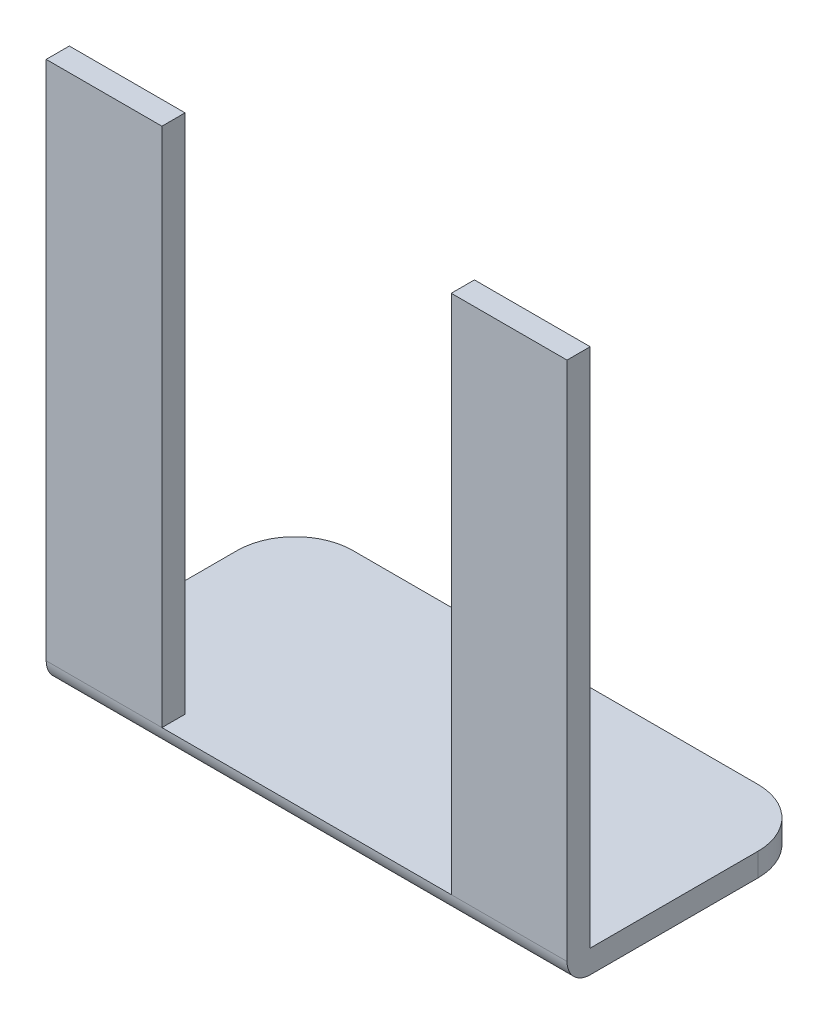
ISO-10303-21;
HEADER;
FILE_DESCRIPTION(('STEP AP214'),'2;1');
FILE_NAME('part.step','',(''),(''),'','','');
FILE_SCHEMA(('AUTOMOTIVE_DESIGN { 1 0 10303 214 1 1 1 1 }'));
ENDSEC;
DATA;
#1=APPLICATION_CONTEXT('core data for automotive mechanical design processes');
#2=APPLICATION_PROTOCOL_DEFINITION('international standard','automotive_design',2000,#1);
#3=PRODUCT_CONTEXT('',#1,'mechanical');
#4=PRODUCT('Part','Part','',(#3));
#5=PRODUCT_RELATED_PRODUCT_CATEGORY('part','',(#4));
#6=PRODUCT_DEFINITION_FORMATION('','',#4);
#7=PRODUCT_DEFINITION_CONTEXT('part definition',#1,'design');
#8=PRODUCT_DEFINITION('design','',#6,#7);
#9=PRODUCT_DEFINITION_SHAPE('','',#8);
#10=(LENGTH_UNIT() NAMED_UNIT(*) SI_UNIT(.MILLI.,.METRE.));
#11=(NAMED_UNIT(*) PLANE_ANGLE_UNIT() SI_UNIT($,.RADIAN.));
#12=(NAMED_UNIT(*) SI_UNIT($,.STERADIAN.) SOLID_ANGLE_UNIT());
#13=UNCERTAINTY_MEASURE_WITH_UNIT(LENGTH_MEASURE(1.E-05),#10,'distance_accuracy_value','');
#14=(GEOMETRIC_REPRESENTATION_CONTEXT(3) GLOBAL_UNCERTAINTY_ASSIGNED_CONTEXT((#13)) GLOBAL_UNIT_ASSIGNED_CONTEXT((#10,
#11,#12)) REPRESENTATION_CONTEXT('',''));
#15=CARTESIAN_POINT('',(0.,0.,0.));
#16=DIRECTION('',(0.,0.,1.));
#17=DIRECTION('',(1.,0.,0.));
#18=AXIS2_PLACEMENT_3D('',#15,#16,#17);
#19=CARTESIAN_POINT('',(0.,0.,0.));
#20=DIRECTION('',(0.,0.,1.));
#21=DIRECTION('',(1.,0.,0.));
#22=AXIS2_PLACEMENT_3D('',#19,#20,#21);
#23=PLANE('',#22);
#24=DIRECTION('',(1.,0.,0.));
#25=VECTOR('',#24,1.);
#26=CARTESIAN_POINT('',(22.5,-21.5,0.));
#27=LINE('',#26,#25);
#28=CARTESIAN_POINT('',(12.5,-21.5,0.));
#29=VERTEX_POINT('',#28);
#30=CARTESIAN_POINT('',(22.5,-21.5,0.));
#31=VERTEX_POINT('',#30);
#32=EDGE_CURVE('E141',#29,#31,#27,.T.);
#33=ORIENTED_EDGE('',*,*,#32,.F.);
#34=DIRECTION('',(0.,-1.,0.));
#35=VECTOR('',#34,1.);
#36=CARTESIAN_POINT('',(12.5,0.,0.));
#37=LINE('',#36,#35);
#38=CARTESIAN_POINT('',(12.5,23.5,0.));
#39=VERTEX_POINT('',#38);
#40=EDGE_CURVE('E131',#39,#29,#37,.T.);
#41=ORIENTED_EDGE('',*,*,#40,.F.);
#42=DIRECTION('',(1.,0.,0.));
#43=VECTOR('',#42,1.);
#44=CARTESIAN_POINT('',(-22.5,23.5,0.));
#45=LINE('',#44,#43);
#46=CARTESIAN_POINT('',(22.5,23.5,0.));
#47=VERTEX_POINT('',#46);
#48=EDGE_CURVE('E186',#39,#47,#45,.T.);
#49=ORIENTED_EDGE('',*,*,#48,.T.);
#50=DIRECTION('',(0.,-1.,0.));
#51=VECTOR('',#50,1.);
#52=CARTESIAN_POINT('',(22.5,23.5,0.));
#53=LINE('',#52,#51);
#54=EDGE_CURVE('E157',#47,#31,#53,.T.);
#55=ORIENTED_EDGE('',*,*,#54,.T.);
#56=EDGE_LOOP('',(#33,#41,#49,#55));
#57=FACE_BOUND('',#56,.T.);
#58=ADVANCED_FACE('F36',(#57),#23,.F.);
#59=CARTESIAN_POINT('',(0.,0.,2.));
#60=DIRECTION('',(0.,0.,1.));
#61=DIRECTION('',(1.,0.,0.));
#62=AXIS2_PLACEMENT_3D('',#59,#60,#61);
#63=PLANE('',#62);
#64=DIRECTION('',(0.,-1.,0.));
#65=VECTOR('',#64,1.);
#66=CARTESIAN_POINT('',(12.5,23.5,2.));
#67=LINE('',#66,#65);
#68=CARTESIAN_POINT('',(12.5,23.5,2.));
#69=VERTEX_POINT('',#68);
#70=CARTESIAN_POINT('',(12.5,-21.5,2.));
#71=VERTEX_POINT('',#70);
#72=EDGE_CURVE('E247',#69,#71,#67,.T.);
#73=ORIENTED_EDGE('',*,*,#72,.T.);
#74=DIRECTION('',(1.,0.,0.));
#75=VECTOR('',#74,1.);
#76=CARTESIAN_POINT('',(22.5,-21.5,2.));
#77=LINE('',#76,#75);
#78=CARTESIAN_POINT('',(22.5,-21.5,2.));
#79=VERTEX_POINT('',#78);
#80=EDGE_CURVE('E198',#71,#79,#77,.T.);
#81=ORIENTED_EDGE('',*,*,#80,.T.);
#82=DIRECTION('',(0.,-1.,0.));
#83=VECTOR('',#82,1.);
#84=CARTESIAN_POINT('',(22.5,23.5,2.));
#85=LINE('',#84,#83);
#86=CARTESIAN_POINT('',(22.5,23.5,2.));
#87=VERTEX_POINT('',#86);
#88=EDGE_CURVE('E174',#87,#79,#85,.T.);
#89=ORIENTED_EDGE('',*,*,#88,.F.);
#90=DIRECTION('',(1.,0.,0.));
#91=VECTOR('',#90,1.);
#92=CARTESIAN_POINT('',(-22.5,23.5,2.));
#93=LINE('',#92,#91);
#94=EDGE_CURVE('E178',#69,#87,#93,.T.);
#95=ORIENTED_EDGE('',*,*,#94,.F.);
#96=EDGE_LOOP('',(#73,#81,#89,#95));
#97=FACE_BOUND('',#96,.T.);
#98=ADVANCED_FACE('F262',(#97),#63,.T.);
#99=DIRECTION('',(0.,-1.,0.));
#100=VECTOR('',#99,1.);
#101=CARTESIAN_POINT('',(-12.5,0.,0.));
#102=LINE('',#101,#100);
#103=CARTESIAN_POINT('',(-12.5,23.5,0.));
#104=VERTEX_POINT('',#103);
#105=CARTESIAN_POINT('',(-12.5,-21.5,0.));
#106=VERTEX_POINT('',#105);
#107=EDGE_CURVE('E142',#104,#106,#102,.T.);
#108=ORIENTED_EDGE('',*,*,#107,.T.);
#109=CARTESIAN_POINT('',(-22.5,-21.5,0.));
#110=VERTEX_POINT('',#109);
#111=EDGE_CURVE('E158',#110,#106,#27,.T.);
#112=ORIENTED_EDGE('',*,*,#111,.F.);
#113=DIRECTION('',(0.,-1.,0.));
#114=VECTOR('',#113,1.);
#115=CARTESIAN_POINT('',(-22.5,23.5,0.));
#116=LINE('',#115,#114);
#117=CARTESIAN_POINT('',(-22.5,23.5,0.));
#118=VERTEX_POINT('',#117);
#119=EDGE_CURVE('E170',#118,#110,#116,.T.);
#120=ORIENTED_EDGE('',*,*,#119,.F.);
#121=EDGE_CURVE('E175',#118,#104,#45,.T.);
#122=ORIENTED_EDGE('',*,*,#121,.T.);
#123=EDGE_LOOP('',(#108,#112,#120,#122));
#124=FACE_BOUND('',#123,.T.);
#125=ADVANCED_FACE('F240',(#124),#23,.F.);
#126=CARTESIAN_POINT('',(-22.5,23.5,2.));
#127=DIRECTION('',(0.,1.,0.));
#128=DIRECTION('',(0.,0.,1.));
#129=AXIS2_PLACEMENT_3D('',#126,#127,#128);
#130=PLANE('',#129);
#131=ORIENTED_EDGE('',*,*,#48,.F.);
#132=DIRECTION('',(0.,0.,1.));
#133=VECTOR('',#132,1.);
#134=CARTESIAN_POINT('',(12.5,23.5,-19.5));
#135=LINE('',#134,#133);
#136=EDGE_CURVE('E137',#39,#69,#135,.T.);
#137=ORIENTED_EDGE('',*,*,#136,.T.);
#138=ORIENTED_EDGE('',*,*,#94,.T.);
#139=DIRECTION('',(0.,0.,-1.));
#140=VECTOR('',#139,1.);
#141=CARTESIAN_POINT('',(22.5,23.5,2.));
#142=LINE('',#141,#140);
#143=EDGE_CURVE('E190',#87,#47,#142,.T.);
#144=ORIENTED_EDGE('',*,*,#143,.T.);
#145=EDGE_LOOP('',(#131,#137,#138,#144));
#146=FACE_BOUND('',#145,.T.);
#147=ADVANCED_FACE('F266',(#146),#130,.T.);
#148=CARTESIAN_POINT('',(-22.5,-21.5,2.));
#149=VERTEX_POINT('',#148);
#150=CARTESIAN_POINT('',(-12.5,-21.5,2.));
#151=VERTEX_POINT('',#150);
#152=EDGE_CURVE('E199',#149,#151,#77,.T.);
#153=ORIENTED_EDGE('',*,*,#152,.T.);
#154=DIRECTION('',(0.,-1.,0.));
#155=VECTOR('',#154,1.);
#156=CARTESIAN_POINT('',(-12.5,23.5,2.));
#157=LINE('',#156,#155);
#158=CARTESIAN_POINT('',(-12.5,23.5,2.));
#159=VERTEX_POINT('',#158);
#160=EDGE_CURVE('E244',#159,#151,#157,.T.);
#161=ORIENTED_EDGE('',*,*,#160,.F.);
#162=CARTESIAN_POINT('',(-22.5,23.5,2.));
#163=VERTEX_POINT('',#162);
#164=EDGE_CURVE('E179',#163,#159,#93,.T.);
#165=ORIENTED_EDGE('',*,*,#164,.F.);
#166=DIRECTION('',(0.,-1.,0.));
#167=VECTOR('',#166,1.);
#168=CARTESIAN_POINT('',(-22.5,23.5,2.));
#169=LINE('',#168,#167);
#170=EDGE_CURVE('E171',#163,#149,#169,.T.);
#171=ORIENTED_EDGE('',*,*,#170,.T.);
#172=EDGE_LOOP('',(#153,#161,#165,#171));
#173=FACE_BOUND('',#172,.T.);
#174=ADVANCED_FACE('F286',(#173),#63,.T.);
#175=CARTESIAN_POINT('',(-22.5,23.5,2.));
#176=DIRECTION('',(1.,0.,0.));
#177=DIRECTION('',(0.,1.,0.));
#178=AXIS2_PLACEMENT_3D('',#175,#176,#177);
#179=PLANE('',#178);
#180=DIRECTION('',(0.,0.,1.));
#181=VECTOR('',#180,1.);
#182=CARTESIAN_POINT('',(-22.5,-21.5,-19.5));
#183=LINE('',#182,#181);
#184=CARTESIAN_POINT('',(-22.5,-21.5,-14.5));
#185=VERTEX_POINT('',#184);
#186=EDGE_CURVE('E168',#185,#110,#183,.T.);
#187=ORIENTED_EDGE('',*,*,#186,.F.);
#188=DIRECTION('',(0.,1.,0.));
#189=VECTOR('',#188,1.);
#190=CARTESIAN_POINT('',(-22.5,23.5,-14.5));
#191=LINE('',#190,#189);
#192=CARTESIAN_POINT('',(-22.5,-23.5,-14.5));
#193=VERTEX_POINT('',#192);
#194=EDGE_CURVE('E218',#185,#193,#191,.F.);
#195=ORIENTED_EDGE('',*,*,#194,.T.);
#196=DIRECTION('',(0.,0.,-1.));
#197=VECTOR('',#196,1.);
#198=CARTESIAN_POINT('',(-22.5,-23.5,2.));
#199=LINE('',#198,#197);
#200=CARTESIAN_POINT('',(-22.5,-23.5,0.));
#201=VERTEX_POINT('',#200);
#202=EDGE_CURVE('E195',#201,#193,#199,.T.);
#203=ORIENTED_EDGE('',*,*,#202,.F.);
#204=CARTESIAN_POINT('',(-22.5,-21.5,0.));
#205=DIRECTION('',(1.,0.,0.));
#206=DIRECTION('',(0.,1.,0.));
#207=AXIS2_PLACEMENT_3D('',#204,#205,#206);
#208=CIRCLE('',#207,2.);
#209=EDGE_CURVE('E206',#201,#149,#208,.F.);
#210=ORIENTED_EDGE('',*,*,#209,.T.);
#211=ORIENTED_EDGE('',*,*,#170,.F.);
#212=DIRECTION('',(0.,0.,-1.));
#213=VECTOR('',#212,1.);
#214=CARTESIAN_POINT('',(-22.5,23.5,2.));
#215=LINE('',#214,#213);
#216=EDGE_CURVE('E182',#163,#118,#215,.T.);
#217=ORIENTED_EDGE('',*,*,#216,.T.);
#218=ORIENTED_EDGE('',*,*,#119,.T.);
#219=EDGE_LOOP('',(#187,#195,#203,#210,#211,#217,#218));
#220=FACE_BOUND('',#219,.T.);
#221=ADVANCED_FACE('F235',(#220),#179,.F.);
#222=CARTESIAN_POINT('',(-22.5,-23.5,2.));
#223=DIRECTION('',(0.,1.,0.));
#224=DIRECTION('',(0.,0.,1.));
#225=AXIS2_PLACEMENT_3D('',#222,#223,#224);
#226=PLANE('',#225);
#227=CARTESIAN_POINT('',(0.,-23.5,-14.5));
#228=DIRECTION('',(0.,1.,0.));
#229=DIRECTION('',(-1.,0.,0.));
#230=AXIS2_PLACEMENT_3D('',#227,#228,#229);
#231=CIRCLE('',#230,1.5);
#232=CARTESIAN_POINT('',(-1.5,-23.5,-14.5));
#233=VERTEX_POINT('',#232);
#234=EDGE_CURVE('E256',#233,#233,#231,.T.);
#235=ORIENTED_EDGE('',*,*,#234,.T.);
#236=EDGE_LOOP('',(#235));
#237=FACE_BOUND('',#236,.T.);
#238=ORIENTED_EDGE('',*,*,#202,.T.);
#239=CARTESIAN_POINT('',(-17.5,-23.5,-14.5));
#240=DIRECTION('',(0.,1.,0.));
#241=DIRECTION('',(0.,0.,1.));
#242=AXIS2_PLACEMENT_3D('',#239,#240,#241);
#243=CIRCLE('',#242,5.);
#244=CARTESIAN_POINT('',(-17.5,-23.5,-19.5));
#245=VERTEX_POINT('',#244);
#246=EDGE_CURVE('E44',#193,#245,#243,.F.);
#247=ORIENTED_EDGE('',*,*,#246,.T.);
#248=DIRECTION('',(-1.,0.,0.));
#249=VECTOR('',#248,1.);
#250=CARTESIAN_POINT('',(22.5,-23.5,-19.5));
#251=LINE('',#250,#249);
#252=CARTESIAN_POINT('',(17.5,-23.5,-19.5));
#253=VERTEX_POINT('',#252);
#254=EDGE_CURVE('E161',#253,#245,#251,.T.);
#255=ORIENTED_EDGE('',*,*,#254,.F.);
#256=CARTESIAN_POINT('',(17.5,-23.5,-14.5));
#257=DIRECTION('',(0.,1.,0.));
#258=DIRECTION('',(0.,0.,1.));
#259=AXIS2_PLACEMENT_3D('',#256,#257,#258);
#260=CIRCLE('',#259,5.);
#261=CARTESIAN_POINT('',(22.5,-23.5,-14.5));
#262=VERTEX_POINT('',#261);
#263=EDGE_CURVE('E59',#253,#262,#260,.F.);
#264=ORIENTED_EDGE('',*,*,#263,.T.);
#265=DIRECTION('',(0.,0.,-1.));
#266=VECTOR('',#265,1.);
#267=CARTESIAN_POINT('',(22.5,-23.5,2.));
#268=LINE('',#267,#266);
#269=CARTESIAN_POINT('',(22.5,-23.5,0.));
#270=VERTEX_POINT('',#269);
#271=EDGE_CURVE('E193',#270,#262,#268,.T.);
#272=ORIENTED_EDGE('',*,*,#271,.F.);
#273=DIRECTION('',(1.,0.,0.));
#274=VECTOR('',#273,1.);
#275=CARTESIAN_POINT('',(-22.5,-23.5,0.));
#276=LINE('',#275,#274);
#277=EDGE_CURVE('E204',#270,#201,#276,.F.);
#278=ORIENTED_EDGE('',*,*,#277,.T.);
#279=EDGE_LOOP('',(#238,#247,#255,#264,#272,#278));
#280=FACE_BOUND('',#279,.T.);
#281=ADVANCED_FACE('F222',(#237,#280),#226,.F.);
#282=CARTESIAN_POINT('',(22.5,23.5,2.));
#283=DIRECTION('',(1.,0.,0.));
#284=DIRECTION('',(0.,1.,0.));
#285=AXIS2_PLACEMENT_3D('',#282,#283,#284);
#286=PLANE('',#285);
#287=ORIENTED_EDGE('',*,*,#271,.T.);
#288=DIRECTION('',(0.,-1.,0.));
#289=VECTOR('',#288,1.);
#290=CARTESIAN_POINT('',(22.5,-21.5,-14.5));
#291=LINE('',#290,#289);
#292=CARTESIAN_POINT('',(22.5,-21.5,-14.5));
#293=VERTEX_POINT('',#292);
#294=EDGE_CURVE('E11',#262,#293,#291,.F.);
#295=ORIENTED_EDGE('',*,*,#294,.T.);
#296=DIRECTION('',(0.,0.,1.));
#297=VECTOR('',#296,1.);
#298=CARTESIAN_POINT('',(22.5,-21.5,-19.5));
#299=LINE('',#298,#297);
#300=EDGE_CURVE('E166',#293,#31,#299,.T.);
#301=ORIENTED_EDGE('',*,*,#300,.T.);
#302=ORIENTED_EDGE('',*,*,#54,.F.);
#303=ORIENTED_EDGE('',*,*,#143,.F.);
#304=ORIENTED_EDGE('',*,*,#88,.T.);
#305=CARTESIAN_POINT('',(22.5,-21.5,0.));
#306=DIRECTION('',(1.,0.,0.));
#307=DIRECTION('',(0.,1.,0.));
#308=AXIS2_PLACEMENT_3D('',#305,#306,#307);
#309=CIRCLE('',#308,2.);
#310=EDGE_CURVE('E202',#79,#270,#309,.T.);
#311=ORIENTED_EDGE('',*,*,#310,.T.);
#312=EDGE_LOOP('',(#287,#295,#301,#302,#303,#304,#311));
#313=FACE_BOUND('',#312,.T.);
#314=ADVANCED_FACE('F269',(#313),#286,.T.);
#315=DIRECTION('',(0.,0.,1.));
#316=VECTOR('',#315,1.);
#317=CARTESIAN_POINT('',(-12.5,23.5,-19.5));
#318=LINE('',#317,#316);
#319=EDGE_CURVE('E51',#104,#159,#318,.T.);
#320=ORIENTED_EDGE('',*,*,#319,.F.);
#321=ORIENTED_EDGE('',*,*,#121,.F.);
#322=ORIENTED_EDGE('',*,*,#216,.F.);
#323=ORIENTED_EDGE('',*,*,#164,.T.);
#324=EDGE_LOOP('',(#320,#321,#322,#323));
#325=FACE_BOUND('',#324,.T.);
#326=ADVANCED_FACE('F242',(#325),#130,.T.);
#327=CARTESIAN_POINT('',(22.5,-21.5,-19.5));
#328=DIRECTION('',(0.,-1.,0.));
#329=DIRECTION('',(1.,0.,0.));
#330=AXIS2_PLACEMENT_3D('',#327,#328,#329);
#331=PLANE('',#330);
#332=CARTESIAN_POINT('',(0.,-21.5,-14.5));
#333=DIRECTION('',(0.,1.,0.));
#334=DIRECTION('',(-1.,0.,0.));
#335=AXIS2_PLACEMENT_3D('',#332,#333,#334);
#336=CIRCLE('',#335,1.5);
#337=CARTESIAN_POINT('',(-1.5,-21.5,-14.5));
#338=VERTEX_POINT('',#337);
#339=EDGE_CURVE('E253',#338,#338,#336,.T.);
#340=ORIENTED_EDGE('',*,*,#339,.F.);
#341=EDGE_LOOP('',(#340));
#342=FACE_BOUND('',#341,.T.);
#343=DIRECTION('',(1.,0.,0.));
#344=VECTOR('',#343,1.);
#345=CARTESIAN_POINT('',(22.5,-21.5,-19.5));
#346=LINE('',#345,#344);
#347=CARTESIAN_POINT('',(-17.5,-21.5,-19.5));
#348=VERTEX_POINT('',#347);
#349=CARTESIAN_POINT('',(17.5,-21.5,-19.5));
#350=VERTEX_POINT('',#349);
#351=EDGE_CURVE('E164',#348,#350,#346,.T.);
#352=ORIENTED_EDGE('',*,*,#351,.F.);
#353=CARTESIAN_POINT('',(-17.5,-21.5,-14.5));
#354=DIRECTION('',(0.,-1.,0.));
#355=DIRECTION('',(1.,0.,0.));
#356=AXIS2_PLACEMENT_3D('',#353,#354,#355);
#357=CIRCLE('',#356,5.);
#358=EDGE_CURVE('E216',#348,#185,#357,.F.);
#359=ORIENTED_EDGE('',*,*,#358,.T.);
#360=ORIENTED_EDGE('',*,*,#186,.T.);
#361=ORIENTED_EDGE('',*,*,#111,.T.);
#362=DIRECTION('',(0.,0.,-1.));
#363=VECTOR('',#362,1.);
#364=CARTESIAN_POINT('',(-12.5,-21.5,10.));
#365=LINE('',#364,#363);
#366=EDGE_CURVE('E153',#151,#106,#365,.T.);
#367=ORIENTED_EDGE('',*,*,#366,.F.);
#368=EDGE_CURVE('E152',#151,#71,#77,.T.);
#369=ORIENTED_EDGE('',*,*,#368,.T.);
#370=DIRECTION('',(0.,0.,-1.));
#371=VECTOR('',#370,1.);
#372=CARTESIAN_POINT('',(12.5,-21.5,10.));
#373=LINE('',#372,#371);
#374=EDGE_CURVE('E134',#71,#29,#373,.T.);
#375=ORIENTED_EDGE('',*,*,#374,.T.);
#376=ORIENTED_EDGE('',*,*,#32,.T.);
#377=ORIENTED_EDGE('',*,*,#300,.F.);
#378=CARTESIAN_POINT('',(17.5,-21.5,-14.5));
#379=DIRECTION('',(0.,-1.,0.));
#380=DIRECTION('',(1.,0.,0.));
#381=AXIS2_PLACEMENT_3D('',#378,#379,#380);
#382=CIRCLE('',#381,5.);
#383=EDGE_CURVE('E214',#293,#350,#382,.F.);
#384=ORIENTED_EDGE('',*,*,#383,.T.);
#385=EDGE_LOOP('',(#352,#359,#360,#361,#367,#369,#375,#376,#377,#384));
#386=FACE_BOUND('',#385,.T.);
#387=ADVANCED_FACE('F147',(#342,#386),#331,.F.);
#388=CARTESIAN_POINT('',(0.,0.,-19.5));
#389=DIRECTION('',(0.,0.,1.));
#390=DIRECTION('',(1.,0.,0.));
#391=AXIS2_PLACEMENT_3D('',#388,#389,#390);
#392=PLANE('',#391);
#393=ORIENTED_EDGE('',*,*,#254,.T.);
#394=DIRECTION('',(0.,1.,0.));
#395=VECTOR('',#394,1.);
#396=CARTESIAN_POINT('',(-17.5,0.,-19.5));
#397=LINE('',#396,#395);
#398=EDGE_CURVE('E211',#245,#348,#397,.T.);
#399=ORIENTED_EDGE('',*,*,#398,.T.);
#400=ORIENTED_EDGE('',*,*,#351,.T.);
#401=DIRECTION('',(0.,-1.,0.));
#402=VECTOR('',#401,1.);
#403=CARTESIAN_POINT('',(17.5,-23.5,-19.5));
#404=LINE('',#403,#402);
#405=EDGE_CURVE('E208',#350,#253,#404,.T.);
#406=ORIENTED_EDGE('',*,*,#405,.T.);
#407=EDGE_LOOP('',(#393,#399,#400,#406));
#408=FACE_BOUND('',#407,.T.);
#409=ADVANCED_FACE('F228',(#408),#392,.F.);
#410=CARTESIAN_POINT('',(0.,-21.5,0.));
#411=DIRECTION('',(-1.,0.,0.));
#412=DIRECTION('',(0.,0.,1.));
#413=AXIS2_PLACEMENT_3D('',#410,#411,#412);
#414=CYLINDRICAL_SURFACE('',#413,2.);
#415=ORIENTED_EDGE('',*,*,#209,.F.);
#416=ORIENTED_EDGE('',*,*,#277,.F.);
#417=ORIENTED_EDGE('',*,*,#310,.F.);
#418=ORIENTED_EDGE('',*,*,#80,.F.);
#419=ORIENTED_EDGE('',*,*,#368,.F.);
#420=ORIENTED_EDGE('',*,*,#152,.F.);
#421=EDGE_LOOP('',(#415,#416,#417,#418,#419,#420));
#422=FACE_BOUND('',#421,.T.);
#423=ADVANCED_FACE('F279',(#422),#414,.T.);
#424=CARTESIAN_POINT('',(-17.5,0.,-14.5));
#425=DIRECTION('',(0.,1.,0.));
#426=DIRECTION('',(-1.,0.,0.));
#427=AXIS2_PLACEMENT_3D('',#424,#425,#426);
#428=CYLINDRICAL_SURFACE('',#427,5.);
#429=ORIENTED_EDGE('',*,*,#246,.F.);
#430=ORIENTED_EDGE('',*,*,#194,.F.);
#431=ORIENTED_EDGE('',*,*,#358,.F.);
#432=ORIENTED_EDGE('',*,*,#398,.F.);
#433=EDGE_LOOP('',(#429,#430,#431,#432));
#434=FACE_BOUND('',#433,.T.);
#435=ADVANCED_FACE('F231',(#434),#428,.T.);
#436=CARTESIAN_POINT('',(17.5,0.,-14.5));
#437=DIRECTION('',(0.,1.,0.));
#438=DIRECTION('',(-1.,0.,0.));
#439=AXIS2_PLACEMENT_3D('',#436,#437,#438);
#440=CYLINDRICAL_SURFACE('',#439,5.);
#441=ORIENTED_EDGE('',*,*,#383,.F.);
#442=ORIENTED_EDGE('',*,*,#294,.F.);
#443=ORIENTED_EDGE('',*,*,#263,.F.);
#444=ORIENTED_EDGE('',*,*,#405,.F.);
#445=EDGE_LOOP('',(#441,#442,#443,#444));
#446=FACE_BOUND('',#445,.T.);
#447=ADVANCED_FACE('F38',(#446),#440,.T.);
#448=CARTESIAN_POINT('',(12.5,23.5,-19.5));
#449=DIRECTION('',(-1.,0.,0.));
#450=DIRECTION('',(0.,-1.,0.));
#451=AXIS2_PLACEMENT_3D('',#448,#449,#450);
#452=PLANE('',#451);
#453=ORIENTED_EDGE('',*,*,#40,.T.);
#454=ORIENTED_EDGE('',*,*,#374,.F.);
#455=ORIENTED_EDGE('',*,*,#72,.F.);
#456=ORIENTED_EDGE('',*,*,#136,.F.);
#457=EDGE_LOOP('',(#453,#454,#455,#456));
#458=FACE_BOUND('',#457,.T.);
#459=ADVANCED_FACE('F133',(#458),#452,.T.);
#460=CARTESIAN_POINT('',(-12.5,23.5,-19.5));
#461=DIRECTION('',(-1.,0.,0.));
#462=DIRECTION('',(0.,-1.,0.));
#463=AXIS2_PLACEMENT_3D('',#460,#461,#462);
#464=PLANE('',#463);
#465=ORIENTED_EDGE('',*,*,#319,.T.);
#466=ORIENTED_EDGE('',*,*,#160,.T.);
#467=ORIENTED_EDGE('',*,*,#366,.T.);
#468=ORIENTED_EDGE('',*,*,#107,.F.);
#469=EDGE_LOOP('',(#465,#466,#467,#468));
#470=FACE_BOUND('',#469,.T.);
#471=ADVANCED_FACE('F252',(#470),#464,.F.);
#472=CARTESIAN_POINT('',(0.,-23.5,-14.5));
#473=DIRECTION('',(0.,1.,0.));
#474=DIRECTION('',(-1.,0.,0.));
#475=AXIS2_PLACEMENT_3D('',#472,#473,#474);
#476=CYLINDRICAL_SURFACE('',#475,1.5);
#477=ORIENTED_EDGE('',*,*,#234,.F.);
#478=EDGE_LOOP('',(#477));
#479=FACE_BOUND('',#478,.T.);
#480=ORIENTED_EDGE('',*,*,#339,.T.);
#481=EDGE_LOOP('',(#480));
#482=FACE_BOUND('',#481,.T.);
#483=ADVANCED_FACE('F326',(#479,#482),#476,.F.);
#484=CLOSED_SHELL('',(#58,#98,#125,#147,#174,#221,#281,#314,#326,#387,#409,#423,#435,#447,#459,
#471,#483));
#485=MANIFOLD_SOLID_BREP('B2',#484);
#486=ADVANCED_BREP_SHAPE_REPRESENTATION('',(#18,#485),#14);
#487=SHAPE_DEFINITION_REPRESENTATION(#9,#486);
ENDSEC;
END-ISO-10303-21;
